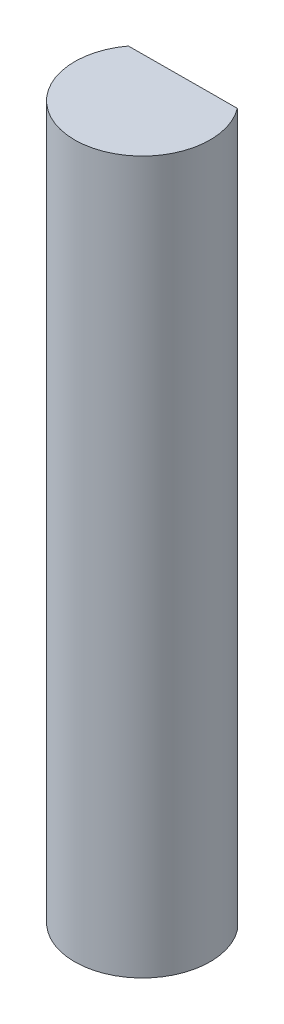
ISO-10303-21;
HEADER;
FILE_DESCRIPTION(('STEP AP214'),'2;1');
FILE_NAME('part.step','',(''),(''),'','','');
FILE_SCHEMA(('AUTOMOTIVE_DESIGN { 1 0 10303 214 1 1 1 1 }'));
ENDSEC;
DATA;
#1=APPLICATION_CONTEXT('core data for automotive mechanical design processes');
#2=APPLICATION_PROTOCOL_DEFINITION('international standard','automotive_design',2000,#1);
#3=PRODUCT_CONTEXT('',#1,'mechanical');
#4=PRODUCT('Part','Part','',(#3));
#5=PRODUCT_RELATED_PRODUCT_CATEGORY('part','',(#4));
#6=PRODUCT_DEFINITION_FORMATION('','',#4);
#7=PRODUCT_DEFINITION_CONTEXT('part definition',#1,'design');
#8=PRODUCT_DEFINITION('design','',#6,#7);
#9=PRODUCT_DEFINITION_SHAPE('','',#8);
#10=(LENGTH_UNIT() NAMED_UNIT(*) SI_UNIT(.MILLI.,.METRE.));
#11=(NAMED_UNIT(*) PLANE_ANGLE_UNIT() SI_UNIT($,.RADIAN.));
#12=(NAMED_UNIT(*) SI_UNIT($,.STERADIAN.) SOLID_ANGLE_UNIT());
#13=UNCERTAINTY_MEASURE_WITH_UNIT(LENGTH_MEASURE(1.E-05),#10,'distance_accuracy_value','');
#14=(GEOMETRIC_REPRESENTATION_CONTEXT(3) GLOBAL_UNCERTAINTY_ASSIGNED_CONTEXT((#13)) GLOBAL_UNIT_ASSIGNED_CONTEXT((#10,
#11,#12)) REPRESENTATION_CONTEXT('',''));
#15=CARTESIAN_POINT('',(0.,0.,0.));
#16=DIRECTION('',(0.,0.,1.));
#17=DIRECTION('',(1.,0.,0.));
#18=AXIS2_PLACEMENT_3D('',#15,#16,#17);
#19=CARTESIAN_POINT('',(0.,16.66875,0.));
#20=DIRECTION('',(0.,-1.,0.));
#21=DIRECTION('',(0.,0.,-1.));
#22=AXIS2_PLACEMENT_3D('',#19,#20,#21);
#23=CYLINDRICAL_SURFACE('',#22,3.175);
#24=CARTESIAN_POINT('',(0.,16.66875,0.));
#25=DIRECTION('',(0.,1.,0.));
#26=DIRECTION('',(0.,0.,1.));
#27=AXIS2_PLACEMENT_3D('',#24,#25,#26);
#28=CIRCLE('',#27,3.175);
#29=CARTESIAN_POINT('',(-2.54932246413979,16.66875,-1.8925062678449));
#30=VERTEX_POINT('',#29);
#31=CARTESIAN_POINT('',(2.53067753586021,16.66875,-1.91736699916643));
#32=VERTEX_POINT('',#31);
#33=EDGE_CURVE('E11',#30,#32,#28,.T.);
#34=ORIENTED_EDGE('',*,*,#33,.F.);
#35=DIRECTION('',(0.,1.,0.));
#36=VECTOR('',#35,1.);
#37=CARTESIAN_POINT('',(-2.54932246413979,-16.66875,-1.8925062678449));
#38=LINE('',#37,#36);
#39=CARTESIAN_POINT('',(-2.54932246413979,-16.66875,-1.8925062678449));
#40=VERTEX_POINT('',#39);
#41=EDGE_CURVE('E62',#40,#30,#38,.T.);
#42=ORIENTED_EDGE('',*,*,#41,.F.);
#43=CARTESIAN_POINT('',(0.,-16.66875,0.));
#44=DIRECTION('',(0.,1.,0.));
#45=DIRECTION('',(0.,0.,1.));
#46=AXIS2_PLACEMENT_3D('',#43,#44,#45);
#47=CIRCLE('',#46,3.175);
#48=CARTESIAN_POINT('',(2.53067753586021,-16.66875,-1.91736699916643));
#49=VERTEX_POINT('',#48);
#50=EDGE_CURVE('E39',#40,#49,#47,.T.);
#51=ORIENTED_EDGE('',*,*,#50,.T.);
#52=DIRECTION('',(0.,1.,0.));
#53=VECTOR('',#52,1.);
#54=CARTESIAN_POINT('',(2.53067753586021,-16.66875,-1.91736699916643));
#55=LINE('',#54,#53);
#56=EDGE_CURVE('E50',#49,#32,#55,.T.);
#57=ORIENTED_EDGE('',*,*,#56,.T.);
#58=EDGE_LOOP('',(#34,#42,#51,#57));
#59=FACE_BOUND('',#58,.T.);
#60=ADVANCED_FACE('F36',(#59),#23,.T.);
#61=CARTESIAN_POINT('',(0.,16.66875,0.));
#62=DIRECTION('',(0.,1.,0.));
#63=DIRECTION('',(0.,0.,1.));
#64=AXIS2_PLACEMENT_3D('',#61,#62,#63);
#65=PLANE('',#64);
#66=DIRECTION('',(0.999988025356881,0.,-0.00489378614628873));
#67=VECTOR('',#66,1.);
#68=CARTESIAN_POINT('',(-2.54932246413979,16.66875,-1.8925062678449));
#69=LINE('',#68,#67);
#70=EDGE_CURVE('E60',#30,#32,#69,.T.);
#71=ORIENTED_EDGE('',*,*,#70,.F.);
#72=ORIENTED_EDGE('',*,*,#33,.T.);
#73=EDGE_LOOP('',(#71,#72));
#74=FACE_BOUND('',#73,.T.);
#75=ADVANCED_FACE('F70',(#74),#65,.T.);
#76=CARTESIAN_POINT('',(0.,-16.66875,0.));
#77=DIRECTION('',(0.,1.,0.));
#78=DIRECTION('',(0.,0.,1.));
#79=AXIS2_PLACEMENT_3D('',#76,#77,#78);
#80=PLANE('',#79);
#81=ORIENTED_EDGE('',*,*,#50,.F.);
#82=DIRECTION('',(0.999988025356881,0.,-0.00489378614628873));
#83=VECTOR('',#82,1.);
#84=CARTESIAN_POINT('',(-2.54932246413979,-16.66875,-1.8925062678449));
#85=LINE('',#84,#83);
#86=EDGE_CURVE('E55',#40,#49,#85,.T.);
#87=ORIENTED_EDGE('',*,*,#86,.T.);
#88=EDGE_LOOP('',(#81,#87));
#89=FACE_BOUND('',#88,.T.);
#90=ADVANCED_FACE('F72',(#89),#80,.F.);
#91=CARTESIAN_POINT('',(-2.54932246413979,-16.66875,-1.8925062678449));
#92=DIRECTION('',(0.00489378614628873,0.,0.999988025356881));
#93=DIRECTION('',(0.999988025356881,0.,-0.00489378614628873));
#94=AXIS2_PLACEMENT_3D('',#91,#92,#93);
#95=PLANE('',#94);
#96=ORIENTED_EDGE('',*,*,#70,.T.);
#97=ORIENTED_EDGE('',*,*,#56,.F.);
#98=ORIENTED_EDGE('',*,*,#86,.F.);
#99=ORIENTED_EDGE('',*,*,#41,.T.);
#100=EDGE_LOOP('',(#96,#97,#98,#99));
#101=FACE_BOUND('',#100,.T.);
#102=ADVANCED_FACE('F61',(#101),#95,.F.);
#103=CLOSED_SHELL('',(#60,#75,#90,#102));
#104=MANIFOLD_SOLID_BREP('B2',#103);
#105=ADVANCED_BREP_SHAPE_REPRESENTATION('',(#18,#104),#14);
#106=SHAPE_DEFINITION_REPRESENTATION(#9,#105);
ENDSEC;
END-ISO-10303-21;
